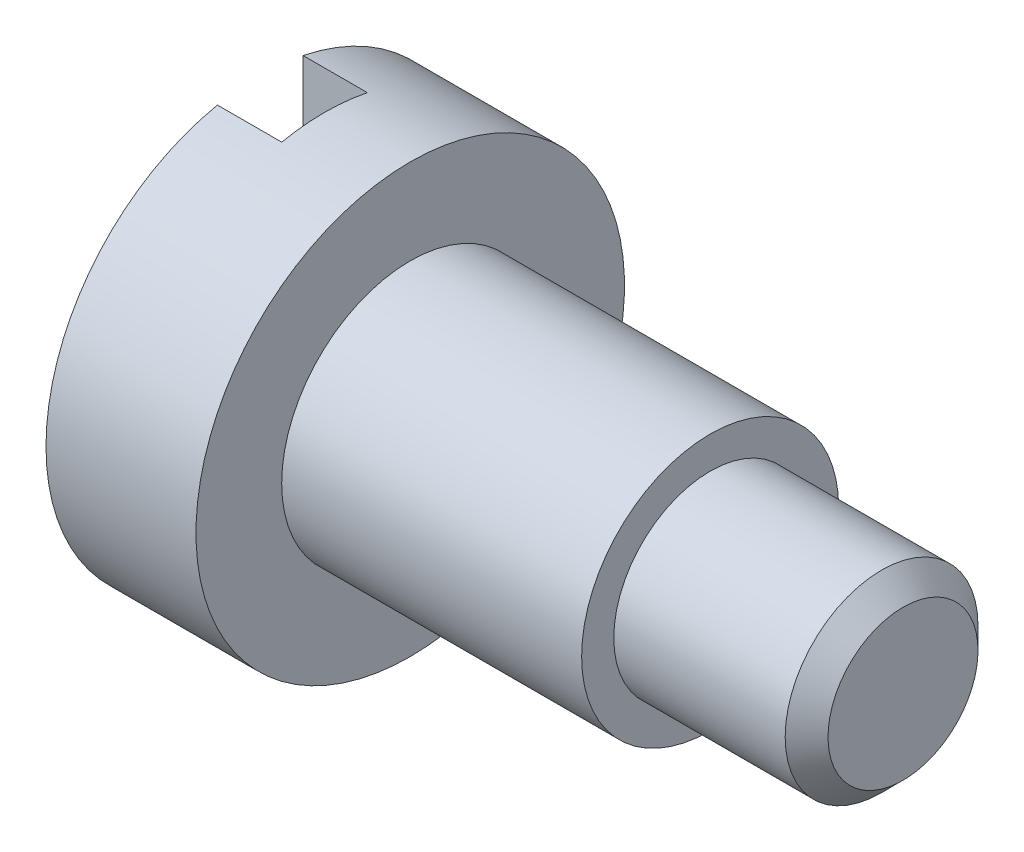
ISO-10303-21;
HEADER;
FILE_DESCRIPTION(('STEP AP214'),'2;1');
FILE_NAME('part.step','',(''),(''),'','','');
FILE_SCHEMA(('AUTOMOTIVE_DESIGN { 1 0 10303 214 1 1 1 1 }'));
ENDSEC;
DATA;
#1=APPLICATION_CONTEXT('core data for automotive mechanical design processes');
#2=APPLICATION_PROTOCOL_DEFINITION('international standard','automotive_design',2000,#1);
#3=PRODUCT_CONTEXT('',#1,'mechanical');
#4=PRODUCT('Part','Part','',(#3));
#5=PRODUCT_RELATED_PRODUCT_CATEGORY('part','',(#4));
#6=PRODUCT_DEFINITION_FORMATION('','',#4);
#7=PRODUCT_DEFINITION_CONTEXT('part definition',#1,'design');
#8=PRODUCT_DEFINITION('design','',#6,#7);
#9=PRODUCT_DEFINITION_SHAPE('','',#8);
#10=(LENGTH_UNIT() NAMED_UNIT(*) SI_UNIT(.MILLI.,.METRE.));
#11=(NAMED_UNIT(*) PLANE_ANGLE_UNIT() SI_UNIT($,.RADIAN.));
#12=(NAMED_UNIT(*) SI_UNIT($,.STERADIAN.) SOLID_ANGLE_UNIT());
#13=UNCERTAINTY_MEASURE_WITH_UNIT(LENGTH_MEASURE(1.E-05),#10,'distance_accuracy_value','');
#14=(GEOMETRIC_REPRESENTATION_CONTEXT(3) GLOBAL_UNCERTAINTY_ASSIGNED_CONTEXT((#13)) GLOBAL_UNIT_ASSIGNED_CONTEXT((#10,
#11,#12)) REPRESENTATION_CONTEXT('',''));
#15=CARTESIAN_POINT('',(0.,0.,0.));
#16=DIRECTION('',(0.,0.,1.));
#17=DIRECTION('',(1.,0.,0.));
#18=AXIS2_PLACEMENT_3D('',#15,#16,#17);
#19=CARTESIAN_POINT('',(0.,0.,0.));
#20=DIRECTION('',(-1.,0.,0.));
#21=DIRECTION('',(0.,-1.,0.));
#22=AXIS2_PLACEMENT_3D('',#19,#20,#21);
#23=PLANE('',#22);
#24=DIRECTION('',(0.,-1.,0.));
#25=VECTOR('',#24,1.);
#26=CARTESIAN_POINT('',(0.,6.3649826379617,-1.));
#27=LINE('',#26,#25);
#28=CARTESIAN_POINT('',(0.,4.89897948556636,-1.));
#29=VERTEX_POINT('',#28);
#30=CARTESIAN_POINT('',(0.,-4.89897948556636,-0.999999999999999));
#31=VERTEX_POINT('',#30);
#32=EDGE_CURVE('E74',#29,#31,#27,.T.);
#33=ORIENTED_EDGE('',*,*,#32,.F.);
#34=CARTESIAN_POINT('',(0.,0.,0.));
#35=DIRECTION('',(1.,0.,0.));
#36=DIRECTION('',(0.,1.,0.));
#37=AXIS2_PLACEMENT_3D('',#34,#35,#36);
#38=CIRCLE('',#37,5.);
#39=EDGE_CURVE('E81',#31,#29,#38,.T.);
#40=ORIENTED_EDGE('',*,*,#39,.F.);
#41=EDGE_LOOP('',(#33,#40));
#42=FACE_BOUND('',#41,.T.);
#43=ADVANCED_FACE('F33',(#42),#23,.T.);
#44=DIRECTION('',(0.,1.,0.));
#45=VECTOR('',#44,1.);
#46=CARTESIAN_POINT('',(0.,6.3649826379617,1.));
#47=LINE('',#46,#45);
#48=CARTESIAN_POINT('',(0.,-4.89897948556636,1.));
#49=VERTEX_POINT('',#48);
#50=CARTESIAN_POINT('',(0.,4.89897948556636,1.));
#51=VERTEX_POINT('',#50);
#52=EDGE_CURVE('E82',#49,#51,#47,.T.);
#53=ORIENTED_EDGE('',*,*,#52,.F.);
#54=EDGE_CURVE('E88',#51,#49,#38,.T.);
#55=ORIENTED_EDGE('',*,*,#54,.F.);
#56=EDGE_LOOP('',(#53,#55));
#57=FACE_BOUND('',#56,.T.);
#58=ADVANCED_FACE('F35',(#57),#23,.T.);
#59=CARTESIAN_POINT('',(15.,0.,0.));
#60=DIRECTION('',(1.,0.,0.));
#61=DIRECTION('',(0.,1.,0.));
#62=AXIS2_PLACEMENT_3D('',#59,#60,#61);
#63=CYLINDRICAL_SURFACE('',#62,5.);
#64=DIRECTION('',(1.,0.,0.));
#65=VECTOR('',#64,1.);
#66=CARTESIAN_POINT('',(15.,4.89897948556636,-1.));
#67=LINE('',#66,#65);
#68=CARTESIAN_POINT('',(1.5,4.89897948556636,-1.));
#69=VERTEX_POINT('',#68);
#70=EDGE_CURVE('E11',#69,#29,#67,.F.);
#71=ORIENTED_EDGE('',*,*,#70,.F.);
#72=CARTESIAN_POINT('',(1.5,0.,0.));
#73=DIRECTION('',(-1.,0.,0.));
#74=DIRECTION('',(0.,-1.,0.));
#75=AXIS2_PLACEMENT_3D('',#72,#73,#74);
#76=CIRCLE('',#75,5.);
#77=CARTESIAN_POINT('',(1.5,4.89897948556636,1.));
#78=VERTEX_POINT('',#77);
#79=EDGE_CURVE('E100',#69,#78,#76,.F.);
#80=ORIENTED_EDGE('',*,*,#79,.T.);
#81=DIRECTION('',(1.,0.,0.));
#82=VECTOR('',#81,1.);
#83=CARTESIAN_POINT('',(15.,4.89897948556636,1.));
#84=LINE('',#83,#82);
#85=EDGE_CURVE('E41',#51,#78,#84,.T.);
#86=ORIENTED_EDGE('',*,*,#85,.F.);
#87=ORIENTED_EDGE('',*,*,#54,.T.);
#88=DIRECTION('',(1.,0.,0.));
#89=VECTOR('',#88,1.);
#90=CARTESIAN_POINT('',(15.,-4.89897948556636,1.));
#91=LINE('',#90,#89);
#92=CARTESIAN_POINT('',(1.5,-4.89897948556636,1.));
#93=VERTEX_POINT('',#92);
#94=EDGE_CURVE('E99',#93,#49,#91,.F.);
#95=ORIENTED_EDGE('',*,*,#94,.F.);
#96=CARTESIAN_POINT('',(1.5,-4.89897948556636,-0.999999999999999));
#97=VERTEX_POINT('',#96);
#98=EDGE_CURVE('E92',#93,#97,#76,.F.);
#99=ORIENTED_EDGE('',*,*,#98,.T.);
#100=DIRECTION('',(1.,0.,0.));
#101=VECTOR('',#100,1.);
#102=CARTESIAN_POINT('',(15.,-4.89897948556636,-0.999999999999999));
#103=LINE('',#102,#101);
#104=EDGE_CURVE('E87',#31,#97,#103,.T.);
#105=ORIENTED_EDGE('',*,*,#104,.F.);
#106=ORIENTED_EDGE('',*,*,#39,.T.);
#107=EDGE_LOOP('',(#71,#80,#86,#87,#95,#99,#105,#106));
#108=FACE_BOUND('',#107,.T.);
#109=CARTESIAN_POINT('',(3.5,0.,0.));
#110=DIRECTION('',(1.,0.,0.));
#111=DIRECTION('',(0.,1.,0.));
#112=AXIS2_PLACEMENT_3D('',#109,#110,#111);
#113=CIRCLE('',#112,5.);
#114=CARTESIAN_POINT('',(3.5,5.,0.));
#115=VERTEX_POINT('',#114);
#116=EDGE_CURVE('E89',#115,#115,#113,.T.);
#117=ORIENTED_EDGE('',*,*,#116,.F.);
#118=EDGE_LOOP('',(#117));
#119=FACE_BOUND('',#118,.T.);
#120=ADVANCED_FACE('F84',(#108,#119),#63,.T.);
#121=CARTESIAN_POINT('',(3.5,5.,0.));
#122=DIRECTION('',(1.,0.,0.));
#123=DIRECTION('',(0.,1.,0.));
#124=AXIS2_PLACEMENT_3D('',#121,#122,#123);
#125=PLANE('',#124);
#126=ORIENTED_EDGE('',*,*,#116,.T.);
#127=EDGE_LOOP('',(#126));
#128=FACE_BOUND('',#127,.T.);
#129=CARTESIAN_POINT('',(3.5,0.,0.));
#130=DIRECTION('',(1.,0.,0.));
#131=DIRECTION('',(0.,1.,0.));
#132=AXIS2_PLACEMENT_3D('',#129,#130,#131);
#133=CIRCLE('',#132,3.);
#134=CARTESIAN_POINT('',(3.5,3.,0.));
#135=VERTEX_POINT('',#134);
#136=EDGE_CURVE('E94',#135,#135,#133,.T.);
#137=ORIENTED_EDGE('',*,*,#136,.F.);
#138=EDGE_LOOP('',(#137));
#139=FACE_BOUND('',#138,.T.);
#140=ADVANCED_FACE('F127',(#128,#139),#125,.T.);
#141=CARTESIAN_POINT('',(15.,0.,0.));
#142=DIRECTION('',(1.,0.,0.));
#143=DIRECTION('',(0.,1.,0.));
#144=AXIS2_PLACEMENT_3D('',#141,#142,#143);
#145=CYLINDRICAL_SURFACE('',#144,3.);
#146=ORIENTED_EDGE('',*,*,#136,.T.);
#147=EDGE_LOOP('',(#146));
#148=FACE_BOUND('',#147,.T.);
#149=CARTESIAN_POINT('',(10.5,0.,0.));
#150=DIRECTION('',(1.,0.,0.));
#151=DIRECTION('',(0.,1.,0.));
#152=AXIS2_PLACEMENT_3D('',#149,#150,#151);
#153=CIRCLE('',#152,3.);
#154=CARTESIAN_POINT('',(10.5,3.,0.));
#155=VERTEX_POINT('',#154);
#156=EDGE_CURVE('E119',#155,#155,#153,.T.);
#157=ORIENTED_EDGE('',*,*,#156,.F.);
#158=EDGE_LOOP('',(#157));
#159=FACE_BOUND('',#158,.T.);
#160=ADVANCED_FACE('F124',(#148,#159),#145,.T.);
#161=CARTESIAN_POINT('',(10.5,3.,0.));
#162=DIRECTION('',(1.,0.,0.));
#163=DIRECTION('',(0.,1.,0.));
#164=AXIS2_PLACEMENT_3D('',#161,#162,#163);
#165=PLANE('',#164);
#166=ORIENTED_EDGE('',*,*,#156,.T.);
#167=EDGE_LOOP('',(#166));
#168=FACE_BOUND('',#167,.T.);
#169=CARTESIAN_POINT('',(10.5,0.,0.));
#170=DIRECTION('',(1.,0.,0.));
#171=DIRECTION('',(0.,1.,0.));
#172=AXIS2_PLACEMENT_3D('',#169,#170,#171);
#173=CIRCLE('',#172,2.25);
#174=CARTESIAN_POINT('',(10.5,2.25,0.));
#175=VERTEX_POINT('',#174);
#176=EDGE_CURVE('E116',#175,#175,#173,.T.);
#177=ORIENTED_EDGE('',*,*,#176,.F.);
#178=EDGE_LOOP('',(#177));
#179=FACE_BOUND('',#178,.T.);
#180=ADVANCED_FACE('F135',(#168,#179),#165,.T.);
#181=CARTESIAN_POINT('',(15.,0.,0.));
#182=DIRECTION('',(1.,0.,0.));
#183=DIRECTION('',(0.,1.,0.));
#184=AXIS2_PLACEMENT_3D('',#181,#182,#183);
#185=CYLINDRICAL_SURFACE('',#184,2.25);
#186=ORIENTED_EDGE('',*,*,#176,.T.);
#187=EDGE_LOOP('',(#186));
#188=FACE_BOUND('',#187,.T.);
#189=CARTESIAN_POINT('',(14.5,0.,0.));
#190=DIRECTION('',(1.,0.,0.));
#191=DIRECTION('',(0.,1.,0.));
#192=AXIS2_PLACEMENT_3D('',#189,#190,#191);
#193=CIRCLE('',#192,2.25);
#194=CARTESIAN_POINT('',(14.5,2.25,0.));
#195=VERTEX_POINT('',#194);
#196=EDGE_CURVE('E109',#195,#195,#193,.T.);
#197=ORIENTED_EDGE('',*,*,#196,.F.);
#198=EDGE_LOOP('',(#197));
#199=FACE_BOUND('',#198,.T.);
#200=ADVANCED_FACE('F162',(#188,#199),#185,.T.);
#201=CARTESIAN_POINT('',(15.,0.,0.));
#202=DIRECTION('',(-1.,0.,0.));
#203=DIRECTION('',(0.,-1.,0.));
#204=AXIS2_PLACEMENT_3D('',#201,#202,#203);
#205=CONICAL_SURFACE('',#204,1.75,0.78539816339745);
#206=ORIENTED_EDGE('',*,*,#196,.T.);
#207=EDGE_LOOP('',(#206));
#208=FACE_BOUND('',#207,.T.);
#209=CARTESIAN_POINT('',(15.,0.,0.));
#210=DIRECTION('',(1.,0.,0.));
#211=DIRECTION('',(0.,1.,0.));
#212=AXIS2_PLACEMENT_3D('',#209,#210,#211);
#213=CIRCLE('',#212,1.75);
#214=CARTESIAN_POINT('',(15.,1.75,0.));
#215=VERTEX_POINT('',#214);
#216=EDGE_CURVE('E106',#215,#215,#213,.T.);
#217=ORIENTED_EDGE('',*,*,#216,.F.);
#218=EDGE_LOOP('',(#217));
#219=FACE_BOUND('',#218,.T.);
#220=ADVANCED_FACE('F158',(#208,#219),#205,.T.);
#221=CARTESIAN_POINT('',(15.,1.75,0.));
#222=DIRECTION('',(1.,0.,0.));
#223=DIRECTION('',(0.,1.,0.));
#224=AXIS2_PLACEMENT_3D('',#221,#222,#223);
#225=PLANE('',#224);
#226=ORIENTED_EDGE('',*,*,#216,.T.);
#227=EDGE_LOOP('',(#226));
#228=FACE_BOUND('',#227,.T.);
#229=ADVANCED_FACE('F153',(#228),#225,.T.);
#230=CARTESIAN_POINT('',(1.5,6.3649826379617,-1.));
#231=DIRECTION('',(0.,0.,-1.));
#232=DIRECTION('',(0.,1.,0.));
#233=AXIS2_PLACEMENT_3D('',#230,#231,#232);
#234=PLANE('',#233);
#235=ORIENTED_EDGE('',*,*,#70,.T.);
#236=ORIENTED_EDGE('',*,*,#32,.T.);
#237=ORIENTED_EDGE('',*,*,#104,.T.);
#238=DIRECTION('',(0.,-1.,0.));
#239=VECTOR('',#238,1.);
#240=CARTESIAN_POINT('',(1.5,6.3649826379617,-1.));
#241=LINE('',#240,#239);
#242=EDGE_CURVE('E48',#69,#97,#241,.T.);
#243=ORIENTED_EDGE('',*,*,#242,.F.);
#244=EDGE_LOOP('',(#235,#236,#237,#243));
#245=FACE_BOUND('',#244,.T.);
#246=ADVANCED_FACE('F73',(#245),#234,.F.);
#247=CARTESIAN_POINT('',(1.5,6.3649826379617,1.));
#248=DIRECTION('',(0.,0.,1.));
#249=DIRECTION('',(0.,-1.,0.));
#250=AXIS2_PLACEMENT_3D('',#247,#248,#249);
#251=PLANE('',#250);
#252=ORIENTED_EDGE('',*,*,#94,.T.);
#253=ORIENTED_EDGE('',*,*,#52,.T.);
#254=ORIENTED_EDGE('',*,*,#85,.T.);
#255=DIRECTION('',(0.,1.,0.));
#256=VECTOR('',#255,1.);
#257=CARTESIAN_POINT('',(1.5,6.3649826379617,1.));
#258=LINE('',#257,#256);
#259=EDGE_CURVE('E104',#93,#78,#258,.T.);
#260=ORIENTED_EDGE('',*,*,#259,.F.);
#261=EDGE_LOOP('',(#252,#253,#254,#260));
#262=FACE_BOUND('',#261,.T.);
#263=ADVANCED_FACE('F145',(#262),#251,.F.);
#264=CARTESIAN_POINT('',(1.5,0.,0.));
#265=DIRECTION('',(-1.,0.,0.));
#266=DIRECTION('',(0.,-1.,0.));
#267=AXIS2_PLACEMENT_3D('',#264,#265,#266);
#268=PLANE('',#267);
#269=ORIENTED_EDGE('',*,*,#242,.T.);
#270=ORIENTED_EDGE('',*,*,#98,.F.);
#271=ORIENTED_EDGE('',*,*,#259,.T.);
#272=ORIENTED_EDGE('',*,*,#79,.F.);
#273=EDGE_LOOP('',(#269,#270,#271,#272));
#274=FACE_BOUND('',#273,.T.);
#275=ADVANCED_FACE('F103',(#274),#268,.T.);
#276=CLOSED_SHELL('',(#43,#58,#120,#140,#160,#180,#200,#220,#229,#246,#263,#275));
#277=MANIFOLD_SOLID_BREP('B2',#276);
#278=ADVANCED_BREP_SHAPE_REPRESENTATION('',(#18,#277),#14);
#279=SHAPE_DEFINITION_REPRESENTATION(#9,#278);
ENDSEC;
END-ISO-10303-21;
